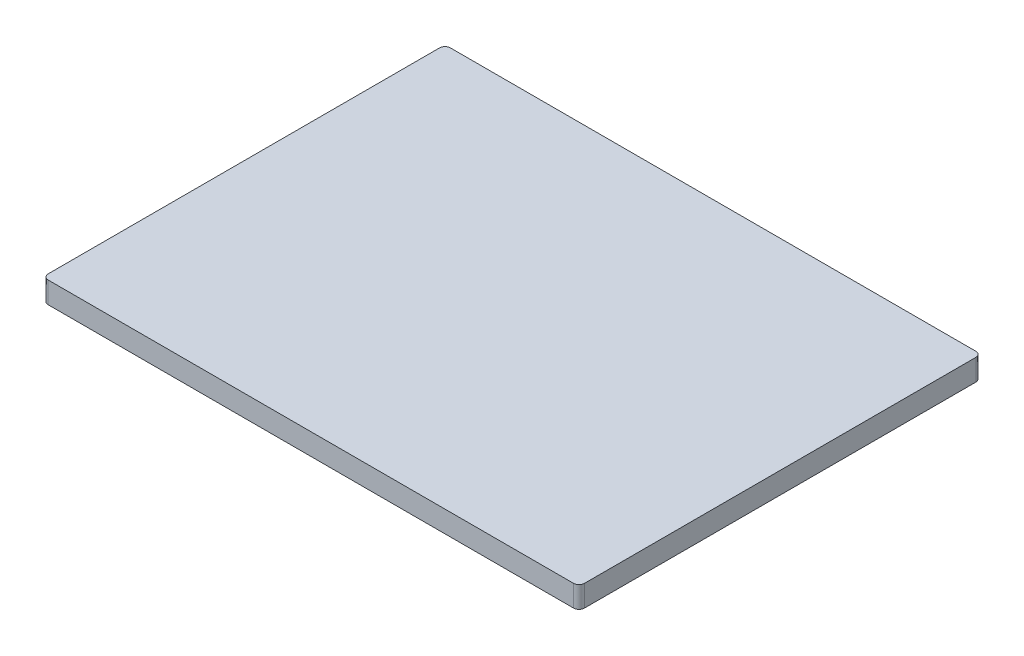
ISO-10303-21;
HEADER;
FILE_DESCRIPTION(('STEP AP214'),'2;1');
FILE_NAME('part.step','',(''),(''),'','','');
FILE_SCHEMA(('AUTOMOTIVE_DESIGN { 1 0 10303 214 1 1 1 1 }'));
ENDSEC;
DATA;
#1=APPLICATION_CONTEXT('core data for automotive mechanical design processes');
#2=APPLICATION_PROTOCOL_DEFINITION('international standard','automotive_design',2000,#1);
#3=PRODUCT_CONTEXT('',#1,'mechanical');
#4=PRODUCT('Part','Part','',(#3));
#5=PRODUCT_RELATED_PRODUCT_CATEGORY('part','',(#4));
#6=PRODUCT_DEFINITION_FORMATION('','',#4);
#7=PRODUCT_DEFINITION_CONTEXT('part definition',#1,'design');
#8=PRODUCT_DEFINITION('design','',#6,#7);
#9=PRODUCT_DEFINITION_SHAPE('','',#8);
#10=(LENGTH_UNIT() NAMED_UNIT(*) SI_UNIT(.MILLI.,.METRE.));
#11=(NAMED_UNIT(*) PLANE_ANGLE_UNIT() SI_UNIT($,.RADIAN.));
#12=(NAMED_UNIT(*) SI_UNIT($,.STERADIAN.) SOLID_ANGLE_UNIT());
#13=UNCERTAINTY_MEASURE_WITH_UNIT(LENGTH_MEASURE(1.E-05),#10,'distance_accuracy_value','');
#14=(GEOMETRIC_REPRESENTATION_CONTEXT(3) GLOBAL_UNCERTAINTY_ASSIGNED_CONTEXT((#13)) GLOBAL_UNIT_ASSIGNED_CONTEXT((#10,
#11,#12)) REPRESENTATION_CONTEXT('',''));
#15=CARTESIAN_POINT('',(0.,0.,0.));
#16=DIRECTION('',(0.,0.,1.));
#17=DIRECTION('',(1.,0.,0.));
#18=AXIS2_PLACEMENT_3D('',#15,#16,#17);
#19=CARTESIAN_POINT('',(100.,8.,75.));
#20=DIRECTION('',(-1.,0.,0.));
#21=DIRECTION('',(0.,0.,1.));
#22=AXIS2_PLACEMENT_3D('',#19,#20,#21);
#23=PLANE('',#22);
#24=DIRECTION('',(0.,0.,-1.));
#25=VECTOR('',#24,1.);
#26=CARTESIAN_POINT('',(100.,0.,75.));
#27=LINE('',#26,#25);
#28=CARTESIAN_POINT('',(100.,0.,73.));
#29=VERTEX_POINT('',#28);
#30=CARTESIAN_POINT('',(100.,0.,-73.));
#31=VERTEX_POINT('',#30);
#32=EDGE_CURVE('E129',#29,#31,#27,.T.);
#33=ORIENTED_EDGE('',*,*,#32,.T.);
#34=DIRECTION('',(0.,-1.,0.));
#35=VECTOR('',#34,1.);
#36=CARTESIAN_POINT('',(100.,8.,-73.));
#37=LINE('',#36,#35);
#38=CARTESIAN_POINT('',(100.,8.,-73.));
#39=VERTEX_POINT('',#38);
#40=EDGE_CURVE('E152',#31,#39,#37,.F.);
#41=ORIENTED_EDGE('',*,*,#40,.T.);
#42=DIRECTION('',(0.,0.,-1.));
#43=VECTOR('',#42,1.);
#44=CARTESIAN_POINT('',(100.,8.,75.));
#45=LINE('',#44,#43);
#46=CARTESIAN_POINT('',(100.,8.,73.));
#47=VERTEX_POINT('',#46);
#48=EDGE_CURVE('E127',#47,#39,#45,.T.);
#49=ORIENTED_EDGE('',*,*,#48,.F.);
#50=DIRECTION('',(0.,-1.,0.));
#51=VECTOR('',#50,1.);
#52=CARTESIAN_POINT('',(100.,8.,73.));
#53=LINE('',#52,#51);
#54=EDGE_CURVE('E149',#47,#29,#53,.T.);
#55=ORIENTED_EDGE('',*,*,#54,.T.);
#56=EDGE_LOOP('',(#33,#41,#49,#55));
#57=FACE_BOUND('',#56,.T.);
#58=ADVANCED_FACE('F34',(#57),#23,.F.);
#59=CARTESIAN_POINT('',(-100.,8.,-75.));
#60=DIRECTION('',(0.,0.,1.));
#61=DIRECTION('',(1.,0.,0.));
#62=AXIS2_PLACEMENT_3D('',#59,#60,#61);
#63=PLANE('',#62);
#64=DIRECTION('',(-1.,0.,0.));
#65=VECTOR('',#64,1.);
#66=CARTESIAN_POINT('',(-100.,0.,-75.));
#67=LINE('',#66,#65);
#68=CARTESIAN_POINT('',(98.,0.,-75.));
#69=VERTEX_POINT('',#68);
#70=CARTESIAN_POINT('',(-98.,0.,-75.));
#71=VERTEX_POINT('',#70);
#72=EDGE_CURVE('E125',#69,#71,#67,.T.);
#73=ORIENTED_EDGE('',*,*,#72,.T.);
#74=DIRECTION('',(0.,-1.,0.));
#75=VECTOR('',#74,1.);
#76=CARTESIAN_POINT('',(-98.,8.,-75.));
#77=LINE('',#76,#75);
#78=CARTESIAN_POINT('',(-98.,8.,-75.));
#79=VERTEX_POINT('',#78);
#80=EDGE_CURVE('E104',#71,#79,#77,.F.);
#81=ORIENTED_EDGE('',*,*,#80,.T.);
#82=DIRECTION('',(-1.,0.,0.));
#83=VECTOR('',#82,1.);
#84=CARTESIAN_POINT('',(-100.,8.,-75.));
#85=LINE('',#84,#83);
#86=CARTESIAN_POINT('',(98.,8.,-75.));
#87=VERTEX_POINT('',#86);
#88=EDGE_CURVE('E168',#87,#79,#85,.T.);
#89=ORIENTED_EDGE('',*,*,#88,.F.);
#90=DIRECTION('',(0.,-1.,0.));
#91=VECTOR('',#90,1.);
#92=CARTESIAN_POINT('',(98.,8.,-75.));
#93=LINE('',#92,#91);
#94=EDGE_CURVE('E109',#87,#69,#93,.T.);
#95=ORIENTED_EDGE('',*,*,#94,.T.);
#96=EDGE_LOOP('',(#73,#81,#89,#95));
#97=FACE_BOUND('',#96,.T.);
#98=ADVANCED_FACE('F185',(#97),#63,.F.);
#99=CARTESIAN_POINT('',(-100.,8.,75.));
#100=DIRECTION('',(1.,0.,0.));
#101=DIRECTION('',(0.,0.,-1.));
#102=AXIS2_PLACEMENT_3D('',#99,#100,#101);
#103=PLANE('',#102);
#104=DIRECTION('',(0.,0.,1.));
#105=VECTOR('',#104,1.);
#106=CARTESIAN_POINT('',(-100.,8.,75.));
#107=LINE('',#106,#105);
#108=CARTESIAN_POINT('',(-100.,8.,-73.));
#109=VERTEX_POINT('',#108);
#110=CARTESIAN_POINT('',(-100.,8.,73.));
#111=VERTEX_POINT('',#110);
#112=EDGE_CURVE('E118',#109,#111,#107,.T.);
#113=ORIENTED_EDGE('',*,*,#112,.F.);
#114=DIRECTION('',(0.,-1.,0.));
#115=VECTOR('',#114,1.);
#116=CARTESIAN_POINT('',(-100.,8.,-73.));
#117=LINE('',#116,#115);
#118=CARTESIAN_POINT('',(-100.,0.,-73.));
#119=VERTEX_POINT('',#118);
#120=EDGE_CURVE('E103',#109,#119,#117,.T.);
#121=ORIENTED_EDGE('',*,*,#120,.T.);
#122=DIRECTION('',(0.,0.,1.));
#123=VECTOR('',#122,1.);
#124=CARTESIAN_POINT('',(-100.,0.,75.));
#125=LINE('',#124,#123);
#126=CARTESIAN_POINT('',(-100.,0.,73.));
#127=VERTEX_POINT('',#126);
#128=EDGE_CURVE('E116',#119,#127,#125,.T.);
#129=ORIENTED_EDGE('',*,*,#128,.T.);
#130=DIRECTION('',(0.,-1.,0.));
#131=VECTOR('',#130,1.);
#132=CARTESIAN_POINT('',(-100.,8.,73.));
#133=LINE('',#132,#131);
#134=EDGE_CURVE('E120',#127,#111,#133,.F.);
#135=ORIENTED_EDGE('',*,*,#134,.T.);
#136=EDGE_LOOP('',(#113,#121,#129,#135));
#137=FACE_BOUND('',#136,.T.);
#138=ADVANCED_FACE('F115',(#137),#103,.F.);
#139=CARTESIAN_POINT('',(-100.,8.,75.));
#140=DIRECTION('',(0.,0.,-1.));
#141=DIRECTION('',(-1.,0.,0.));
#142=AXIS2_PLACEMENT_3D('',#139,#140,#141);
#143=PLANE('',#142);
#144=DIRECTION('',(1.,0.,0.));
#145=VECTOR('',#144,1.);
#146=CARTESIAN_POINT('',(-100.,0.,75.));
#147=LINE('',#146,#145);
#148=CARTESIAN_POINT('',(-98.,0.,75.));
#149=VERTEX_POINT('',#148);
#150=CARTESIAN_POINT('',(98.,0.,75.));
#151=VERTEX_POINT('',#150);
#152=EDGE_CURVE('E124',#149,#151,#147,.T.);
#153=ORIENTED_EDGE('',*,*,#152,.T.);
#154=DIRECTION('',(0.,-1.,0.));
#155=VECTOR('',#154,1.);
#156=CARTESIAN_POINT('',(98.,8.,75.));
#157=LINE('',#156,#155);
#158=CARTESIAN_POINT('',(98.,8.,75.));
#159=VERTEX_POINT('',#158);
#160=EDGE_CURVE('E11',#151,#159,#157,.F.);
#161=ORIENTED_EDGE('',*,*,#160,.T.);
#162=DIRECTION('',(1.,0.,0.));
#163=VECTOR('',#162,1.);
#164=CARTESIAN_POINT('',(-100.,8.,75.));
#165=LINE('',#164,#163);
#166=CARTESIAN_POINT('',(-98.,8.,75.));
#167=VERTEX_POINT('',#166);
#168=EDGE_CURVE('E133',#167,#159,#165,.T.);
#169=ORIENTED_EDGE('',*,*,#168,.F.);
#170=DIRECTION('',(0.,-1.,0.));
#171=VECTOR('',#170,1.);
#172=CARTESIAN_POINT('',(-98.,8.,75.));
#173=LINE('',#172,#171);
#174=EDGE_CURVE('E42',#167,#149,#173,.T.);
#175=ORIENTED_EDGE('',*,*,#174,.T.);
#176=EDGE_LOOP('',(#153,#161,#169,#175));
#177=FACE_BOUND('',#176,.T.);
#178=ADVANCED_FACE('F155',(#177),#143,.F.);
#179=CARTESIAN_POINT('',(0.,8.,0.));
#180=DIRECTION('',(0.,-1.,0.));
#181=DIRECTION('',(0.,0.,-1.));
#182=AXIS2_PLACEMENT_3D('',#179,#180,#181);
#183=PLANE('',#182);
#184=ORIENTED_EDGE('',*,*,#88,.T.);
#185=CARTESIAN_POINT('',(-98.,8.,-73.));
#186=DIRECTION('',(0.,-1.,0.));
#187=DIRECTION('',(0.,0.,-1.));
#188=AXIS2_PLACEMENT_3D('',#185,#186,#187);
#189=CIRCLE('',#188,2.);
#190=EDGE_CURVE('E147',#79,#109,#189,.F.);
#191=ORIENTED_EDGE('',*,*,#190,.T.);
#192=ORIENTED_EDGE('',*,*,#112,.T.);
#193=CARTESIAN_POINT('',(-98.,8.,73.));
#194=DIRECTION('',(0.,-1.,0.));
#195=DIRECTION('',(0.,0.,-1.));
#196=AXIS2_PLACEMENT_3D('',#193,#194,#195);
#197=CIRCLE('',#196,2.);
#198=EDGE_CURVE('E54',#111,#167,#197,.F.);
#199=ORIENTED_EDGE('',*,*,#198,.T.);
#200=ORIENTED_EDGE('',*,*,#168,.T.);
#201=CARTESIAN_POINT('',(98.,8.,73.));
#202=DIRECTION('',(0.,-1.,0.));
#203=DIRECTION('',(0.,0.,-1.));
#204=AXIS2_PLACEMENT_3D('',#201,#202,#203);
#205=CIRCLE('',#204,2.);
#206=EDGE_CURVE('E143',#159,#47,#205,.F.);
#207=ORIENTED_EDGE('',*,*,#206,.T.);
#208=ORIENTED_EDGE('',*,*,#48,.T.);
#209=CARTESIAN_POINT('',(98.,8.,-73.));
#210=DIRECTION('',(0.,-1.,0.));
#211=DIRECTION('',(0.,0.,-1.));
#212=AXIS2_PLACEMENT_3D('',#209,#210,#211);
#213=CIRCLE('',#212,2.);
#214=EDGE_CURVE('E145',#39,#87,#213,.F.);
#215=ORIENTED_EDGE('',*,*,#214,.T.);
#216=EDGE_LOOP('',(#184,#191,#192,#199,#200,#207,#208,#215));
#217=FACE_BOUND('',#216,.T.);
#218=ADVANCED_FACE('F174',(#217),#183,.F.);
#219=CARTESIAN_POINT('',(0.,0.,0.));
#220=DIRECTION('',(0.,-1.,0.));
#221=DIRECTION('',(0.,0.,-1.));
#222=AXIS2_PLACEMENT_3D('',#219,#220,#221);
#223=PLANE('',#222);
#224=ORIENTED_EDGE('',*,*,#128,.F.);
#225=CARTESIAN_POINT('',(-98.,0.,-73.));
#226=DIRECTION('',(0.,-1.,0.));
#227=DIRECTION('',(0.,0.,-1.));
#228=AXIS2_PLACEMENT_3D('',#225,#226,#227);
#229=CIRCLE('',#228,2.);
#230=EDGE_CURVE('E99',#119,#71,#229,.T.);
#231=ORIENTED_EDGE('',*,*,#230,.T.);
#232=ORIENTED_EDGE('',*,*,#72,.F.);
#233=CARTESIAN_POINT('',(98.,0.,-73.));
#234=DIRECTION('',(0.,-1.,0.));
#235=DIRECTION('',(0.,0.,-1.));
#236=AXIS2_PLACEMENT_3D('',#233,#234,#235);
#237=CIRCLE('',#236,2.);
#238=EDGE_CURVE('E110',#69,#31,#237,.T.);
#239=ORIENTED_EDGE('',*,*,#238,.T.);
#240=ORIENTED_EDGE('',*,*,#32,.F.);
#241=CARTESIAN_POINT('',(98.,0.,73.));
#242=DIRECTION('',(0.,-1.,0.));
#243=DIRECTION('',(0.,0.,-1.));
#244=AXIS2_PLACEMENT_3D('',#241,#242,#243);
#245=CIRCLE('',#244,2.);
#246=EDGE_CURVE('E136',#29,#151,#245,.T.);
#247=ORIENTED_EDGE('',*,*,#246,.T.);
#248=ORIENTED_EDGE('',*,*,#152,.F.);
#249=CARTESIAN_POINT('',(-98.,0.,73.));
#250=DIRECTION('',(0.,-1.,0.));
#251=DIRECTION('',(0.,0.,-1.));
#252=AXIS2_PLACEMENT_3D('',#249,#250,#251);
#253=CIRCLE('',#252,2.);
#254=EDGE_CURVE('E119',#149,#127,#253,.T.);
#255=ORIENTED_EDGE('',*,*,#254,.T.);
#256=EDGE_LOOP('',(#224,#231,#232,#239,#240,#247,#248,#255));
#257=FACE_BOUND('',#256,.T.);
#258=ADVANCED_FACE('F122',(#257),#223,.T.);
#259=CARTESIAN_POINT('',(-98.,8.,-73.));
#260=DIRECTION('',(0.,-1.,0.));
#261=DIRECTION('',(0.,0.,-1.));
#262=AXIS2_PLACEMENT_3D('',#259,#260,#261);
#263=CYLINDRICAL_SURFACE('',#262,2.);
#264=ORIENTED_EDGE('',*,*,#190,.F.);
#265=ORIENTED_EDGE('',*,*,#80,.F.);
#266=ORIENTED_EDGE('',*,*,#230,.F.);
#267=ORIENTED_EDGE('',*,*,#120,.F.);
#268=EDGE_LOOP('',(#264,#265,#266,#267));
#269=FACE_BOUND('',#268,.T.);
#270=ADVANCED_FACE('F102',(#269),#263,.T.);
#271=CARTESIAN_POINT('',(98.,8.,-73.));
#272=DIRECTION('',(0.,-1.,0.));
#273=DIRECTION('',(0.,0.,-1.));
#274=AXIS2_PLACEMENT_3D('',#271,#272,#273);
#275=CYLINDRICAL_SURFACE('',#274,2.);
#276=ORIENTED_EDGE('',*,*,#214,.F.);
#277=ORIENTED_EDGE('',*,*,#40,.F.);
#278=ORIENTED_EDGE('',*,*,#238,.F.);
#279=ORIENTED_EDGE('',*,*,#94,.F.);
#280=EDGE_LOOP('',(#276,#277,#278,#279));
#281=FACE_BOUND('',#280,.T.);
#282=ADVANCED_FACE('F196',(#281),#275,.T.);
#283=CARTESIAN_POINT('',(98.,8.,73.));
#284=DIRECTION('',(0.,-1.,0.));
#285=DIRECTION('',(0.,0.,-1.));
#286=AXIS2_PLACEMENT_3D('',#283,#284,#285);
#287=CYLINDRICAL_SURFACE('',#286,2.);
#288=ORIENTED_EDGE('',*,*,#206,.F.);
#289=ORIENTED_EDGE('',*,*,#160,.F.);
#290=ORIENTED_EDGE('',*,*,#246,.F.);
#291=ORIENTED_EDGE('',*,*,#54,.F.);
#292=EDGE_LOOP('',(#288,#289,#290,#291));
#293=FACE_BOUND('',#292,.T.);
#294=ADVANCED_FACE('F162',(#293),#287,.T.);
#295=CARTESIAN_POINT('',(-98.,8.,73.));
#296=DIRECTION('',(0.,-1.,0.));
#297=DIRECTION('',(0.,0.,-1.));
#298=AXIS2_PLACEMENT_3D('',#295,#296,#297);
#299=CYLINDRICAL_SURFACE('',#298,2.);
#300=ORIENTED_EDGE('',*,*,#198,.F.);
#301=ORIENTED_EDGE('',*,*,#134,.F.);
#302=ORIENTED_EDGE('',*,*,#254,.F.);
#303=ORIENTED_EDGE('',*,*,#174,.F.);
#304=EDGE_LOOP('',(#300,#301,#302,#303));
#305=FACE_BOUND('',#304,.T.);
#306=ADVANCED_FACE('F36',(#305),#299,.T.);
#307=CLOSED_SHELL('',(#58,#98,#138,#178,#218,#258,#270,#282,#294,#306));
#308=MANIFOLD_SOLID_BREP('B2',#307);
#309=ADVANCED_BREP_SHAPE_REPRESENTATION('',(#18,#308),#14);
#310=SHAPE_DEFINITION_REPRESENTATION(#9,#309);
ENDSEC;
END-ISO-10303-21;
